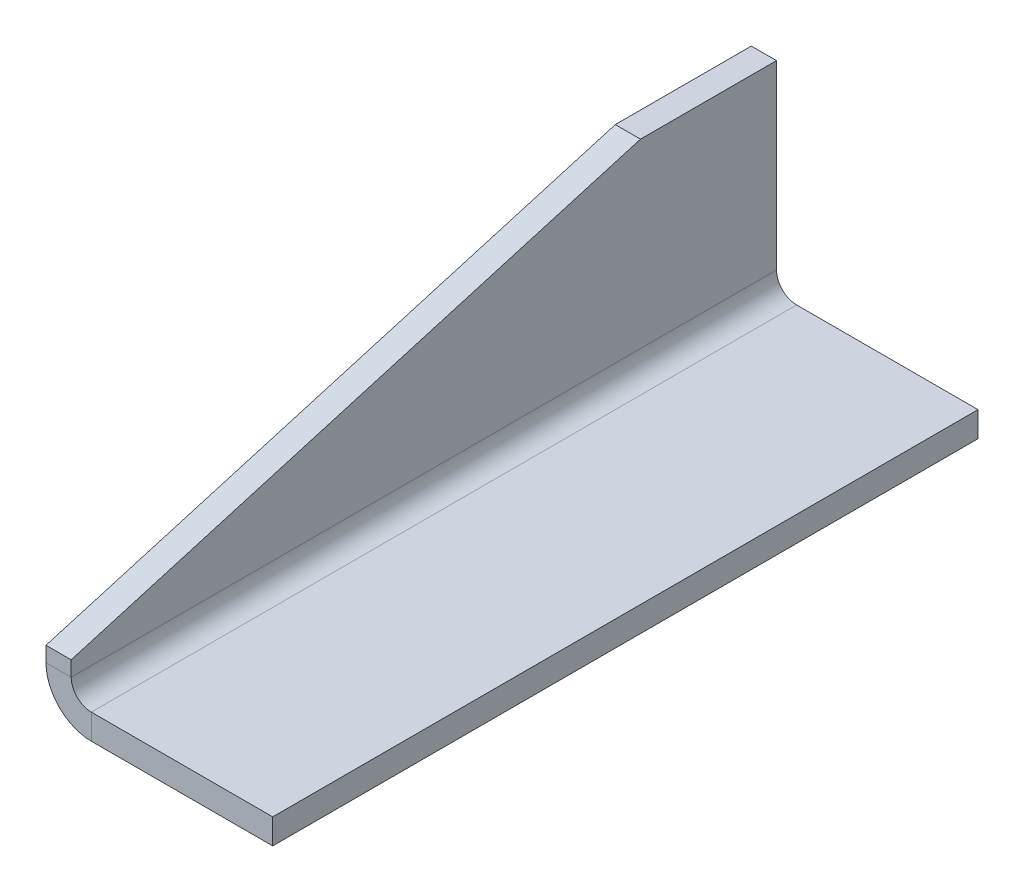
ISO-10303-21;
HEADER;
FILE_DESCRIPTION(('STEP AP214'),'2;1');
FILE_NAME('part.step','',(''),(''),'','','');
FILE_SCHEMA(('AUTOMOTIVE_DESIGN { 1 0 10303 214 1 1 1 1 }'));
ENDSEC;
DATA;
#1=APPLICATION_CONTEXT('core data for automotive mechanical design processes');
#2=APPLICATION_PROTOCOL_DEFINITION('international standard','automotive_design',2000,#1);
#3=PRODUCT_CONTEXT('',#1,'mechanical');
#4=PRODUCT('Part','Part','',(#3));
#5=PRODUCT_RELATED_PRODUCT_CATEGORY('part','',(#4));
#6=PRODUCT_DEFINITION_FORMATION('','',#4);
#7=PRODUCT_DEFINITION_CONTEXT('part definition',#1,'design');
#8=PRODUCT_DEFINITION('design','',#6,#7);
#9=PRODUCT_DEFINITION_SHAPE('','',#8);
#10=(LENGTH_UNIT() NAMED_UNIT(*) SI_UNIT(.MILLI.,.METRE.));
#11=(NAMED_UNIT(*) PLANE_ANGLE_UNIT() SI_UNIT($,.RADIAN.));
#12=(NAMED_UNIT(*) SI_UNIT($,.STERADIAN.) SOLID_ANGLE_UNIT());
#13=UNCERTAINTY_MEASURE_WITH_UNIT(LENGTH_MEASURE(1.E-05),#10,'distance_accuracy_value','');
#14=(GEOMETRIC_REPRESENTATION_CONTEXT(3) GLOBAL_UNCERTAINTY_ASSIGNED_CONTEXT((#13)) GLOBAL_UNIT_ASSIGNED_CONTEXT((#10,
#11,#12)) REPRESENTATION_CONTEXT('',''));
#15=CARTESIAN_POINT('',(0.,0.,0.));
#16=DIRECTION('',(0.,0.,1.));
#17=DIRECTION('',(1.,0.,0.));
#18=AXIS2_PLACEMENT_3D('',#15,#16,#17);
#19=CARTESIAN_POINT('',(0.,0.,88.9));
#20=DIRECTION('',(1.,0.,0.));
#21=DIRECTION('',(0.,0.,-1.));
#22=AXIS2_PLACEMENT_3D('',#19,#20,#21);
#23=PLANE('',#22);
#24=DIRECTION('',(0.,0.,-1.));
#25=VECTOR('',#24,1.);
#26=CARTESIAN_POINT('',(0.,25.4,88.9));
#27=LINE('',#26,#25);
#28=CARTESIAN_POINT('',(0.,25.4,17.145));
#29=VERTEX_POINT('',#28);
#30=CARTESIAN_POINT('',(0.,25.4,0.));
#31=VERTEX_POINT('',#30);
#32=EDGE_CURVE('E139',#29,#31,#27,.T.);
#33=ORIENTED_EDGE('',*,*,#32,.F.);
#34=DIRECTION('',(0.,0.280326181574611,-0.959904803573666));
#35=VECTOR('',#34,1.);
#36=CARTESIAN_POINT('',(0.,28.0174848462982,8.18209734449416));
#37=LINE('',#36,#35);
#38=CARTESIAN_POINT('',(0.,4.445,88.9));
#39=VERTEX_POINT('',#38);
#40=EDGE_CURVE('E120',#39,#29,#37,.T.);
#41=ORIENTED_EDGE('',*,*,#40,.F.);
#42=DIRECTION('',(0.,-1.,0.));
#43=VECTOR('',#42,1.);
#44=CARTESIAN_POINT('',(0.,0.,88.9));
#45=LINE('',#44,#43);
#46=CARTESIAN_POINT('',(0.,2.54,88.9));
#47=VERTEX_POINT('',#46);
#48=EDGE_CURVE('E112',#39,#47,#45,.T.);
#49=ORIENTED_EDGE('',*,*,#48,.T.);
#50=DIRECTION('',(0.,0.,-1.));
#51=VECTOR('',#50,1.);
#52=CARTESIAN_POINT('',(0.,2.54,88.9));
#53=LINE('',#52,#51);
#54=CARTESIAN_POINT('',(0.,2.54,0.));
#55=VERTEX_POINT('',#54);
#56=EDGE_CURVE('E117',#47,#55,#53,.T.);
#57=ORIENTED_EDGE('',*,*,#56,.T.);
#58=DIRECTION('',(0.,-1.,0.));
#59=VECTOR('',#58,1.);
#60=CARTESIAN_POINT('',(0.,0.,0.));
#61=LINE('',#60,#59);
#62=EDGE_CURVE('E164',#31,#55,#61,.T.);
#63=ORIENTED_EDGE('',*,*,#62,.F.);
#64=EDGE_LOOP('',(#33,#41,#49,#57,#63));
#65=FACE_BOUND('',#64,.T.);
#66=ADVANCED_FACE('F36',(#65),#23,.T.);
#67=CARTESIAN_POINT('',(-3.175,25.4,88.9));
#68=DIRECTION('',(0.,1.,0.));
#69=DIRECTION('',(0.,0.,1.));
#70=AXIS2_PLACEMENT_3D('',#67,#68,#69);
#71=PLANE('',#70);
#72=DIRECTION('',(0.,0.,-1.));
#73=VECTOR('',#72,1.);
#74=CARTESIAN_POINT('',(-3.175,25.4,88.9));
#75=LINE('',#74,#73);
#76=CARTESIAN_POINT('',(-3.175,25.4,17.145));
#77=VERTEX_POINT('',#76);
#78=CARTESIAN_POINT('',(-3.175,25.4,0.));
#79=VERTEX_POINT('',#78);
#80=EDGE_CURVE('E179',#77,#79,#75,.T.);
#81=ORIENTED_EDGE('',*,*,#80,.F.);
#82=DIRECTION('',(-1.,0.,0.));
#83=VECTOR('',#82,1.);
#84=CARTESIAN_POINT('',(-3.175,25.4,17.145));
#85=LINE('',#84,#83);
#86=EDGE_CURVE('E241',#77,#29,#85,.F.);
#87=ORIENTED_EDGE('',*,*,#86,.T.);
#88=ORIENTED_EDGE('',*,*,#32,.T.);
#89=DIRECTION('',(1.,0.,0.));
#90=VECTOR('',#89,1.);
#91=CARTESIAN_POINT('',(-3.175,25.4,0.));
#92=LINE('',#91,#90);
#93=EDGE_CURVE('E166',#79,#31,#92,.T.);
#94=ORIENTED_EDGE('',*,*,#93,.F.);
#95=EDGE_LOOP('',(#81,#87,#88,#94));
#96=FACE_BOUND('',#95,.T.);
#97=ADVANCED_FACE('F210',(#96),#71,.T.);
#98=CARTESIAN_POINT('',(-3.175,0.,88.9));
#99=DIRECTION('',(1.,0.,0.));
#100=DIRECTION('',(0.,0.,-1.));
#101=AXIS2_PLACEMENT_3D('',#98,#99,#100);
#102=PLANE('',#101);
#103=DIRECTION('',(0.,0.280326181574611,-0.959904803573666));
#104=VECTOR('',#103,1.);
#105=CARTESIAN_POINT('',(-3.175,28.0174848462982,8.18209734449416));
#106=LINE('',#105,#104);
#107=CARTESIAN_POINT('',(-3.175,4.445,88.9));
#108=VERTEX_POINT('',#107);
#109=EDGE_CURVE('E51',#108,#77,#106,.T.);
#110=ORIENTED_EDGE('',*,*,#109,.T.);
#111=ORIENTED_EDGE('',*,*,#80,.T.);
#112=DIRECTION('',(0.,1.,0.));
#113=VECTOR('',#112,1.);
#114=CARTESIAN_POINT('',(-3.175,0.,0.));
#115=LINE('',#114,#113);
#116=CARTESIAN_POINT('',(-3.175,2.54,0.));
#117=VERTEX_POINT('',#116);
#118=EDGE_CURVE('E169',#79,#117,#115,.F.);
#119=ORIENTED_EDGE('',*,*,#118,.T.);
#120=DIRECTION('',(0.,0.,-1.));
#121=VECTOR('',#120,1.);
#122=CARTESIAN_POINT('',(-3.175,2.54,88.9));
#123=LINE('',#122,#121);
#124=CARTESIAN_POINT('',(-3.175,2.54,88.9));
#125=VERTEX_POINT('',#124);
#126=EDGE_CURVE('E176',#125,#117,#123,.T.);
#127=ORIENTED_EDGE('',*,*,#126,.F.);
#128=DIRECTION('',(0.,1.,0.));
#129=VECTOR('',#128,1.);
#130=CARTESIAN_POINT('',(-3.175,0.,88.9));
#131=LINE('',#130,#129);
#132=EDGE_CURVE('E122',#108,#125,#131,.F.);
#133=ORIENTED_EDGE('',*,*,#132,.F.);
#134=EDGE_LOOP('',(#110,#111,#119,#127,#133));
#135=FACE_BOUND('',#134,.T.);
#136=ADVANCED_FACE('F193',(#135),#102,.F.);
#137=CARTESIAN_POINT('',(2.54,2.54,88.9));
#138=DIRECTION('',(0.,0.,-1.));
#139=DIRECTION('',(-1.,0.,0.));
#140=AXIS2_PLACEMENT_3D('',#137,#138,#139);
#141=PLANE('',#140);
#142=DIRECTION('',(-1.,0.,0.));
#143=VECTOR('',#142,1.);
#144=CARTESIAN_POINT('',(-3.175,4.445,88.9));
#145=LINE('',#144,#143);
#146=EDGE_CURVE('E157',#108,#39,#145,.F.);
#147=ORIENTED_EDGE('',*,*,#146,.F.);
#148=ORIENTED_EDGE('',*,*,#132,.T.);
#149=DIRECTION('',(1.,0.,0.));
#150=VECTOR('',#149,1.);
#151=CARTESIAN_POINT('',(-3.175,2.54,88.9));
#152=LINE('',#151,#150);
#153=EDGE_CURVE('E44',#125,#47,#152,.T.);
#154=ORIENTED_EDGE('',*,*,#153,.T.);
#155=ORIENTED_EDGE('',*,*,#48,.F.);
#156=EDGE_LOOP('',(#147,#148,#154,#155));
#157=FACE_BOUND('',#156,.T.);
#158=ADVANCED_FACE('F126',(#157),#141,.F.);
#159=CARTESIAN_POINT('',(2.54,0.,88.9));
#160=DIRECTION('',(0.,0.,1.));
#161=DIRECTION('',(1.,0.,0.));
#162=AXIS2_PLACEMENT_3D('',#159,#160,#161);
#163=PLANE('',#162);
#164=DIRECTION('',(0.,-1.,0.));
#165=VECTOR('',#164,1.);
#166=CARTESIAN_POINT('',(2.54,0.,88.9));
#167=LINE('',#166,#165);
#168=CARTESIAN_POINT('',(2.54,0.,88.9));
#169=VERTEX_POINT('',#168);
#170=CARTESIAN_POINT('',(2.54,-3.175,88.9));
#171=VERTEX_POINT('',#170);
#172=EDGE_CURVE('E11',#169,#171,#167,.T.);
#173=ORIENTED_EDGE('',*,*,#172,.F.);
#174=CARTESIAN_POINT('',(2.54,2.54,88.9));
#175=DIRECTION('',(0.,0.,-1.));
#176=DIRECTION('',(-1.,0.,0.));
#177=AXIS2_PLACEMENT_3D('',#174,#175,#176);
#178=CIRCLE('',#177,2.54);
#179=EDGE_CURVE('E123',#47,#169,#178,.F.);
#180=ORIENTED_EDGE('',*,*,#179,.F.);
#181=ORIENTED_EDGE('',*,*,#153,.F.);
#182=CARTESIAN_POINT('',(2.54,2.54,88.9));
#183=DIRECTION('',(0.,0.,1.));
#184=DIRECTION('',(1.,0.,0.));
#185=AXIS2_PLACEMENT_3D('',#182,#183,#184);
#186=CIRCLE('',#185,5.715);
#187=EDGE_CURVE('E150',#125,#171,#186,.T.);
#188=ORIENTED_EDGE('',*,*,#187,.T.);
#189=EDGE_LOOP('',(#173,#180,#181,#188));
#190=FACE_BOUND('',#189,.T.);
#191=ADVANCED_FACE('F38',(#190),#163,.T.);
#192=CARTESIAN_POINT('',(-3.175,2.54,88.9));
#193=DIRECTION('',(0.,0.,1.));
#194=DIRECTION('',(1.,0.,0.));
#195=AXIS2_PLACEMENT_3D('',#192,#193,#194);
#196=PLANE('',#195);
#197=DIRECTION('',(1.,0.,0.));
#198=VECTOR('',#197,1.);
#199=CARTESIAN_POINT('',(0.,0.,88.9));
#200=LINE('',#199,#198);
#201=CARTESIAN_POINT('',(25.4,0.,88.9));
#202=VERTEX_POINT('',#201);
#203=EDGE_CURVE('E142',#169,#202,#200,.T.);
#204=ORIENTED_EDGE('',*,*,#203,.F.);
#205=ORIENTED_EDGE('',*,*,#172,.T.);
#206=DIRECTION('',(1.,0.,0.));
#207=VECTOR('',#206,1.);
#208=CARTESIAN_POINT('',(0.,-3.175,88.9));
#209=LINE('',#208,#207);
#210=CARTESIAN_POINT('',(25.4,-3.175,88.9));
#211=VERTEX_POINT('',#210);
#212=EDGE_CURVE('E98',#171,#211,#209,.T.);
#213=ORIENTED_EDGE('',*,*,#212,.T.);
#214=DIRECTION('',(0.,-1.,0.));
#215=VECTOR('',#214,1.);
#216=CARTESIAN_POINT('',(25.4,0.,88.9));
#217=LINE('',#216,#215);
#218=EDGE_CURVE('E145',#202,#211,#217,.T.);
#219=ORIENTED_EDGE('',*,*,#218,.F.);
#220=EDGE_LOOP('',(#204,#205,#213,#219));
#221=FACE_BOUND('',#220,.T.);
#222=ADVANCED_FACE('F201',(#221),#196,.T.);
#223=CARTESIAN_POINT('',(0.,2.54,0.));
#224=DIRECTION('',(0.,0.,-1.));
#225=DIRECTION('',(-1.,0.,0.));
#226=AXIS2_PLACEMENT_3D('',#223,#224,#225);
#227=PLANE('',#226);
#228=DIRECTION('',(-1.,0.,0.));
#229=VECTOR('',#228,1.);
#230=CARTESIAN_POINT('',(0.,2.54,0.));
#231=LINE('',#230,#229);
#232=EDGE_CURVE('E131',#55,#117,#231,.T.);
#233=ORIENTED_EDGE('',*,*,#232,.F.);
#234=CARTESIAN_POINT('',(2.54,2.54,0.));
#235=DIRECTION('',(0.,0.,-1.));
#236=DIRECTION('',(-1.,0.,0.));
#237=AXIS2_PLACEMENT_3D('',#234,#235,#236);
#238=CIRCLE('',#237,2.54);
#239=CARTESIAN_POINT('',(2.54,0.,0.));
#240=VERTEX_POINT('',#239);
#241=EDGE_CURVE('E136',#55,#240,#238,.F.);
#242=ORIENTED_EDGE('',*,*,#241,.T.);
#243=DIRECTION('',(0.,1.,0.));
#244=VECTOR('',#243,1.);
#245=CARTESIAN_POINT('',(2.54,-3.175,0.));
#246=LINE('',#245,#244);
#247=CARTESIAN_POINT('',(2.54,-3.175,0.));
#248=VERTEX_POINT('',#247);
#249=EDGE_CURVE('E92',#248,#240,#246,.T.);
#250=ORIENTED_EDGE('',*,*,#249,.F.);
#251=CARTESIAN_POINT('',(2.54,2.54,0.));
#252=DIRECTION('',(0.,0.,1.));
#253=DIRECTION('',(1.,0.,0.));
#254=AXIS2_PLACEMENT_3D('',#251,#252,#253);
#255=CIRCLE('',#254,5.715);
#256=EDGE_CURVE('E172',#117,#248,#255,.T.);
#257=ORIENTED_EDGE('',*,*,#256,.F.);
#258=EDGE_LOOP('',(#233,#242,#250,#257));
#259=FACE_BOUND('',#258,.T.);
#260=ADVANCED_FACE('F199',(#259),#227,.T.);
#261=CARTESIAN_POINT('',(2.54,-3.175,0.));
#262=DIRECTION('',(0.,0.,-1.));
#263=DIRECTION('',(-1.,0.,0.));
#264=AXIS2_PLACEMENT_3D('',#261,#262,#263);
#265=PLANE('',#264);
#266=ORIENTED_EDGE('',*,*,#62,.T.);
#267=ORIENTED_EDGE('',*,*,#232,.T.);
#268=ORIENTED_EDGE('',*,*,#118,.F.);
#269=ORIENTED_EDGE('',*,*,#93,.T.);
#270=EDGE_LOOP('',(#266,#267,#268,#269));
#271=FACE_BOUND('',#270,.T.);
#272=ADVANCED_FACE('F190',(#271),#265,.T.);
#273=CARTESIAN_POINT('',(0.,-3.175,88.9));
#274=DIRECTION('',(0.,1.,0.));
#275=DIRECTION('',(0.,0.,1.));
#276=AXIS2_PLACEMENT_3D('',#273,#274,#275);
#277=PLANE('',#276);
#278=DIRECTION('',(1.,0.,0.));
#279=VECTOR('',#278,1.);
#280=CARTESIAN_POINT('',(0.,-3.175,0.));
#281=LINE('',#280,#279);
#282=CARTESIAN_POINT('',(25.4,-3.175,0.));
#283=VERTEX_POINT('',#282);
#284=EDGE_CURVE('E153',#248,#283,#281,.T.);
#285=ORIENTED_EDGE('',*,*,#284,.T.);
#286=DIRECTION('',(0.,0.,-1.));
#287=VECTOR('',#286,1.);
#288=CARTESIAN_POINT('',(25.4,-3.175,88.9));
#289=LINE('',#288,#287);
#290=EDGE_CURVE('E185',#211,#283,#289,.T.);
#291=ORIENTED_EDGE('',*,*,#290,.F.);
#292=ORIENTED_EDGE('',*,*,#212,.F.);
#293=DIRECTION('',(0.,0.,-1.));
#294=VECTOR('',#293,1.);
#295=CARTESIAN_POINT('',(2.54,-3.175,88.9));
#296=LINE('',#295,#294);
#297=EDGE_CURVE('E152',#171,#248,#296,.T.);
#298=ORIENTED_EDGE('',*,*,#297,.T.);
#299=EDGE_LOOP('',(#285,#291,#292,#298));
#300=FACE_BOUND('',#299,.T.);
#301=ADVANCED_FACE('F207',(#300),#277,.F.);
#302=CARTESIAN_POINT('',(25.4,0.,88.9));
#303=DIRECTION('',(1.,0.,0.));
#304=DIRECTION('',(0.,0.,-1.));
#305=AXIS2_PLACEMENT_3D('',#302,#303,#304);
#306=PLANE('',#305);
#307=DIRECTION('',(0.,-1.,0.));
#308=VECTOR('',#307,1.);
#309=CARTESIAN_POINT('',(25.4,0.,0.));
#310=LINE('',#309,#308);
#311=CARTESIAN_POINT('',(25.4,0.,0.));
#312=VERTEX_POINT('',#311);
#313=EDGE_CURVE('E156',#312,#283,#310,.T.);
#314=ORIENTED_EDGE('',*,*,#313,.F.);
#315=DIRECTION('',(0.,0.,-1.));
#316=VECTOR('',#315,1.);
#317=CARTESIAN_POINT('',(25.4,0.,88.9));
#318=LINE('',#317,#316);
#319=EDGE_CURVE('E183',#202,#312,#318,.T.);
#320=ORIENTED_EDGE('',*,*,#319,.F.);
#321=ORIENTED_EDGE('',*,*,#218,.T.);
#322=ORIENTED_EDGE('',*,*,#290,.T.);
#323=EDGE_LOOP('',(#314,#320,#321,#322));
#324=FACE_BOUND('',#323,.T.);
#325=ADVANCED_FACE('F224',(#324),#306,.T.);
#326=CARTESIAN_POINT('',(0.,0.,88.9));
#327=DIRECTION('',(0.,1.,0.));
#328=DIRECTION('',(0.,0.,1.));
#329=AXIS2_PLACEMENT_3D('',#326,#327,#328);
#330=PLANE('',#329);
#331=DIRECTION('',(1.,0.,0.));
#332=VECTOR('',#331,1.);
#333=CARTESIAN_POINT('',(0.,0.,0.));
#334=LINE('',#333,#332);
#335=EDGE_CURVE('E160',#240,#312,#334,.T.);
#336=ORIENTED_EDGE('',*,*,#335,.F.);
#337=DIRECTION('',(0.,0.,-1.));
#338=VECTOR('',#337,1.);
#339=CARTESIAN_POINT('',(2.54,0.,88.9));
#340=LINE('',#339,#338);
#341=EDGE_CURVE('E138',#169,#240,#340,.T.);
#342=ORIENTED_EDGE('',*,*,#341,.F.);
#343=ORIENTED_EDGE('',*,*,#203,.T.);
#344=ORIENTED_EDGE('',*,*,#319,.T.);
#345=EDGE_LOOP('',(#336,#342,#343,#344));
#346=FACE_BOUND('',#345,.T.);
#347=ADVANCED_FACE('F221',(#346),#330,.T.);
#348=CARTESIAN_POINT('',(2.54,2.54,88.9));
#349=DIRECTION('',(0.,0.,-1.));
#350=DIRECTION('',(-1.,0.,0.));
#351=AXIS2_PLACEMENT_3D('',#348,#349,#350);
#352=CYLINDRICAL_SURFACE('',#351,2.54);
#353=ORIENTED_EDGE('',*,*,#241,.F.);
#354=ORIENTED_EDGE('',*,*,#56,.F.);
#355=ORIENTED_EDGE('',*,*,#179,.T.);
#356=ORIENTED_EDGE('',*,*,#341,.T.);
#357=EDGE_LOOP('',(#353,#354,#355,#356));
#358=FACE_BOUND('',#357,.T.);
#359=ADVANCED_FACE('F134',(#358),#352,.F.);
#360=CARTESIAN_POINT('',(2.54,2.54,88.9));
#361=DIRECTION('',(0.,0.,-1.));
#362=DIRECTION('',(-1.,0.,0.));
#363=AXIS2_PLACEMENT_3D('',#360,#361,#362);
#364=CYLINDRICAL_SURFACE('',#363,5.715);
#365=ORIENTED_EDGE('',*,*,#256,.T.);
#366=ORIENTED_EDGE('',*,*,#297,.F.);
#367=ORIENTED_EDGE('',*,*,#187,.F.);
#368=ORIENTED_EDGE('',*,*,#126,.T.);
#369=EDGE_LOOP('',(#365,#366,#367,#368));
#370=FACE_BOUND('',#369,.T.);
#371=ADVANCED_FACE('F197',(#370),#364,.T.);
#372=CARTESIAN_POINT('',(2.54,2.54,0.));
#373=DIRECTION('',(0.,0.,-1.));
#374=DIRECTION('',(-1.,0.,0.));
#375=AXIS2_PLACEMENT_3D('',#372,#373,#374);
#376=PLANE('',#375);
#377=ORIENTED_EDGE('',*,*,#284,.F.);
#378=ORIENTED_EDGE('',*,*,#249,.T.);
#379=ORIENTED_EDGE('',*,*,#335,.T.);
#380=ORIENTED_EDGE('',*,*,#313,.T.);
#381=EDGE_LOOP('',(#377,#378,#379,#380));
#382=FACE_BOUND('',#381,.T.);
#383=ADVANCED_FACE('F237',(#382),#376,.T.);
#384=CARTESIAN_POINT('',(-3.175,28.0174848462982,8.18209734449416));
#385=DIRECTION('',(0.,-0.959904803573666,-0.280326181574611));
#386=DIRECTION('',(0.,0.280326181574611,-0.959904803573666));
#387=AXIS2_PLACEMENT_3D('',#384,#385,#386);
#388=PLANE('',#387);
#389=ORIENTED_EDGE('',*,*,#109,.F.);
#390=ORIENTED_EDGE('',*,*,#146,.T.);
#391=ORIENTED_EDGE('',*,*,#40,.T.);
#392=ORIENTED_EDGE('',*,*,#86,.F.);
#393=EDGE_LOOP('',(#389,#390,#391,#392));
#394=FACE_BOUND('',#393,.T.);
#395=ADVANCED_FACE('F247',(#394),#388,.F.);
#396=CLOSED_SHELL('',(#66,#97,#136,#158,#191,#222,#260,#272,#301,#325,#347,#359,#371,#383,#395));
#397=MANIFOLD_SOLID_BREP('B2',#396);
#398=ADVANCED_BREP_SHAPE_REPRESENTATION('',(#18,#397),#14);
#399=SHAPE_DEFINITION_REPRESENTATION(#9,#398);
ENDSEC;
END-ISO-10303-21;
